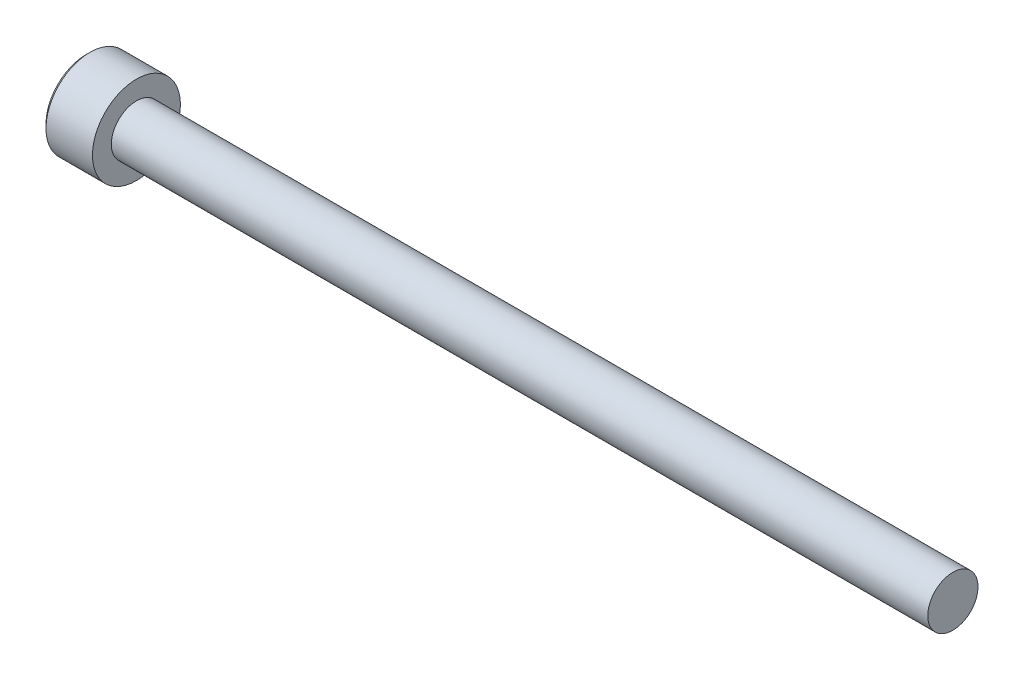
ISO-10303-21;
HEADER;
FILE_DESCRIPTION(('STEP AP214'),'2;1');
FILE_NAME('part.step','',(''),(''),'','','');
FILE_SCHEMA(('AUTOMOTIVE_DESIGN { 1 0 10303 214 1 1 1 1 }'));
ENDSEC;
DATA;
#1=APPLICATION_CONTEXT('core data for automotive mechanical design processes');
#2=APPLICATION_PROTOCOL_DEFINITION('international standard','automotive_design',2000,#1);
#3=PRODUCT_CONTEXT('',#1,'mechanical');
#4=PRODUCT('Part','Part','',(#3));
#5=PRODUCT_RELATED_PRODUCT_CATEGORY('part','',(#4));
#6=PRODUCT_DEFINITION_FORMATION('','',#4);
#7=PRODUCT_DEFINITION_CONTEXT('part definition',#1,'design');
#8=PRODUCT_DEFINITION('design','',#6,#7);
#9=PRODUCT_DEFINITION_SHAPE('','',#8);
#10=(LENGTH_UNIT() NAMED_UNIT(*) SI_UNIT(.MILLI.,.METRE.));
#11=(NAMED_UNIT(*) PLANE_ANGLE_UNIT() SI_UNIT($,.RADIAN.));
#12=(NAMED_UNIT(*) SI_UNIT($,.STERADIAN.) SOLID_ANGLE_UNIT());
#13=UNCERTAINTY_MEASURE_WITH_UNIT(LENGTH_MEASURE(1.E-05),#10,'distance_accuracy_value','');
#14=(GEOMETRIC_REPRESENTATION_CONTEXT(3) GLOBAL_UNCERTAINTY_ASSIGNED_CONTEXT((#13)) GLOBAL_UNIT_ASSIGNED_CONTEXT((#10,
#11,#12)) REPRESENTATION_CONTEXT('',''));
#15=CARTESIAN_POINT('',(0.,0.,0.));
#16=DIRECTION('',(0.,0.,1.));
#17=DIRECTION('',(1.,0.,0.));
#18=AXIS2_PLACEMENT_3D('',#15,#16,#17);
#19=CARTESIAN_POINT('',(-2.,0.,0.));
#20=DIRECTION('',(-1.,0.,0.));
#21=DIRECTION('',(0.,0.,1.));
#22=AXIS2_PLACEMENT_3D('',#19,#20,#21);
#23=PLANE('',#22);
#24=CARTESIAN_POINT('',(-2.,0.,0.));
#25=DIRECTION('',(-1.,0.,0.));
#26=DIRECTION('',(0.,-1.,0.));
#27=AXIS2_PLACEMENT_3D('',#24,#25,#26);
#28=CIRCLE('',#27,1.5);
#29=CARTESIAN_POINT('',(-2.,-1.29903810567666,0.75));
#30=VERTEX_POINT('',#29);
#31=CARTESIAN_POINT('',(-2.,0.,1.5));
#32=VERTEX_POINT('',#31);
#33=EDGE_CURVE('E47',#30,#32,#28,.T.);
#34=ORIENTED_EDGE('',*,*,#33,.F.);
#35=DIRECTION('',(0.,0.5,0.866025403784439));
#36=VECTOR('',#35,1.);
#37=CARTESIAN_POINT('',(-2.,-1.73205080756888,0.));
#38=LINE('',#37,#36);
#39=CARTESIAN_POINT('',(-2.,-0.866025403784439,1.5));
#40=VERTEX_POINT('',#39);
#41=EDGE_CURVE('E229',#30,#40,#38,.T.);
#42=ORIENTED_EDGE('',*,*,#41,.T.);
#43=DIRECTION('',(0.,1.,0.));
#44=VECTOR('',#43,1.);
#45=CARTESIAN_POINT('',(-2.,-0.866025403784439,1.5));
#46=LINE('',#45,#44);
#47=EDGE_CURVE('E197',#40,#32,#46,.T.);
#48=ORIENTED_EDGE('',*,*,#47,.T.);
#49=EDGE_LOOP('',(#34,#42,#48));
#50=FACE_BOUND('',#49,.T.);
#51=ADVANCED_FACE('F36',(#50),#23,.T.);
#52=CARTESIAN_POINT('',(-2.,1.29903810567666,0.75));
#53=VERTEX_POINT('',#52);
#54=EDGE_CURVE('E11',#32,#53,#28,.T.);
#55=ORIENTED_EDGE('',*,*,#54,.F.);
#56=CARTESIAN_POINT('',(-2.,0.866025403784439,1.5));
#57=VERTEX_POINT('',#56);
#58=EDGE_CURVE('E225',#32,#57,#46,.T.);
#59=ORIENTED_EDGE('',*,*,#58,.T.);
#60=DIRECTION('',(0.,0.5,-0.866025403784439));
#61=VECTOR('',#60,1.);
#62=CARTESIAN_POINT('',(-2.,0.866025403784439,1.5));
#63=LINE('',#62,#61);
#64=EDGE_CURVE('E242',#57,#53,#63,.T.);
#65=ORIENTED_EDGE('',*,*,#64,.T.);
#66=EDGE_LOOP('',(#55,#59,#65));
#67=FACE_BOUND('',#66,.T.);
#68=ADVANCED_FACE('F123',(#67),#23,.T.);
#69=CARTESIAN_POINT('',(-2.,1.29903810567666,-0.75));
#70=VERTEX_POINT('',#69);
#71=EDGE_CURVE('E45',#53,#70,#28,.T.);
#72=ORIENTED_EDGE('',*,*,#71,.F.);
#73=CARTESIAN_POINT('',(-2.,1.73205080756888,0.));
#74=VERTEX_POINT('',#73);
#75=EDGE_CURVE('E209',#53,#74,#63,.T.);
#76=ORIENTED_EDGE('',*,*,#75,.T.);
#77=DIRECTION('',(0.,-0.5,-0.866025403784439));
#78=VECTOR('',#77,1.);
#79=CARTESIAN_POINT('',(-2.,1.73205080756888,0.));
#80=LINE('',#79,#78);
#81=EDGE_CURVE('E238',#74,#70,#80,.T.);
#82=ORIENTED_EDGE('',*,*,#81,.T.);
#83=EDGE_LOOP('',(#72,#76,#82));
#84=FACE_BOUND('',#83,.T.);
#85=ADVANCED_FACE('F128',(#84),#23,.T.);
#86=CARTESIAN_POINT('',(-2.,0.,-1.5));
#87=VERTEX_POINT('',#86);
#88=EDGE_CURVE('E245',#70,#87,#28,.T.);
#89=ORIENTED_EDGE('',*,*,#88,.F.);
#90=CARTESIAN_POINT('',(-2.,0.866025403784439,-1.5));
#91=VERTEX_POINT('',#90);
#92=EDGE_CURVE('E241',#70,#91,#80,.T.);
#93=ORIENTED_EDGE('',*,*,#92,.T.);
#94=DIRECTION('',(0.,-1.,0.));
#95=VECTOR('',#94,1.);
#96=CARTESIAN_POINT('',(-2.,0.866025403784439,-1.5));
#97=LINE('',#96,#95);
#98=EDGE_CURVE('E234',#91,#87,#97,.T.);
#99=ORIENTED_EDGE('',*,*,#98,.T.);
#100=EDGE_LOOP('',(#89,#93,#99));
#101=FACE_BOUND('',#100,.T.);
#102=ADVANCED_FACE('F252',(#101),#23,.T.);
#103=CARTESIAN_POINT('',(-2.,-1.29903810567666,-0.75));
#104=VERTEX_POINT('',#103);
#105=EDGE_CURVE('E54',#87,#104,#28,.T.);
#106=ORIENTED_EDGE('',*,*,#105,.F.);
#107=CARTESIAN_POINT('',(-2.,-0.866025403784438,-1.5));
#108=VERTEX_POINT('',#107);
#109=EDGE_CURVE('E237',#87,#108,#97,.T.);
#110=ORIENTED_EDGE('',*,*,#109,.T.);
#111=DIRECTION('',(0.,-0.5,0.866025403784439));
#112=VECTOR('',#111,1.);
#113=CARTESIAN_POINT('',(-2.,-0.866025403784438,-1.5));
#114=LINE('',#113,#112);
#115=EDGE_CURVE('E230',#108,#104,#114,.T.);
#116=ORIENTED_EDGE('',*,*,#115,.T.);
#117=EDGE_LOOP('',(#106,#110,#116));
#118=FACE_BOUND('',#117,.T.);
#119=ADVANCED_FACE('F121',(#118),#23,.T.);
#120=CARTESIAN_POINT('',(-4.,0.,0.));
#121=DIRECTION('',(1.,0.,0.));
#122=DIRECTION('',(0.,1.,0.));
#123=AXIS2_PLACEMENT_3D('',#120,#121,#122);
#124=PLANE('',#123);
#125=DIRECTION('',(0.,-0.5,-0.866025403784439));
#126=VECTOR('',#125,1.);
#127=CARTESIAN_POINT('',(-4.,1.73205080756888,0.));
#128=LINE('',#127,#126);
#129=CARTESIAN_POINT('',(-4.,1.73205080756888,0.));
#130=VERTEX_POINT('',#129);
#131=CARTESIAN_POINT('',(-4.,0.866025403784439,-1.5));
#132=VERTEX_POINT('',#131);
#133=EDGE_CURVE('E219',#130,#132,#128,.T.);
#134=ORIENTED_EDGE('',*,*,#133,.F.);
#135=DIRECTION('',(0.,0.5,-0.866025403784439));
#136=VECTOR('',#135,1.);
#137=CARTESIAN_POINT('',(-4.,0.866025403784439,1.5));
#138=LINE('',#137,#136);
#139=CARTESIAN_POINT('',(-4.,0.866025403784439,1.5));
#140=VERTEX_POINT('',#139);
#141=EDGE_CURVE('E62',#140,#130,#138,.T.);
#142=ORIENTED_EDGE('',*,*,#141,.F.);
#143=DIRECTION('',(0.,1.,0.));
#144=VECTOR('',#143,1.);
#145=CARTESIAN_POINT('',(-4.,-0.866025403784439,1.5));
#146=LINE('',#145,#144);
#147=CARTESIAN_POINT('',(-4.,-0.866025403784439,1.5));
#148=VERTEX_POINT('',#147);
#149=EDGE_CURVE('E206',#148,#140,#146,.T.);
#150=ORIENTED_EDGE('',*,*,#149,.F.);
#151=DIRECTION('',(0.,0.5,0.866025403784439));
#152=VECTOR('',#151,1.);
#153=CARTESIAN_POINT('',(-4.,-1.73205080756888,0.));
#154=LINE('',#153,#152);
#155=CARTESIAN_POINT('',(-4.,-1.73205080756888,0.));
#156=VERTEX_POINT('',#155);
#157=EDGE_CURVE('E210',#156,#148,#154,.T.);
#158=ORIENTED_EDGE('',*,*,#157,.F.);
#159=DIRECTION('',(0.,-0.5,0.866025403784439));
#160=VECTOR('',#159,1.);
#161=CARTESIAN_POINT('',(-4.,-0.866025403784438,-1.5));
#162=LINE('',#161,#160);
#163=CARTESIAN_POINT('',(-4.,-0.866025403784438,-1.5));
#164=VERTEX_POINT('',#163);
#165=EDGE_CURVE('E213',#164,#156,#162,.T.);
#166=ORIENTED_EDGE('',*,*,#165,.F.);
#167=DIRECTION('',(0.,-1.,0.));
#168=VECTOR('',#167,1.);
#169=CARTESIAN_POINT('',(-4.,0.866025403784439,-1.5));
#170=LINE('',#169,#168);
#171=EDGE_CURVE('E216',#132,#164,#170,.T.);
#172=ORIENTED_EDGE('',*,*,#171,.F.);
#173=EDGE_LOOP('',(#134,#142,#150,#158,#166,#172));
#174=FACE_BOUND('',#173,.T.);
#175=CARTESIAN_POINT('',(-4.,0.,0.));
#176=DIRECTION('',(-1.,0.,0.));
#177=DIRECTION('',(0.,-1.,0.));
#178=AXIS2_PLACEMENT_3D('',#175,#176,#177);
#179=CIRCLE('',#178,3.2);
#180=CARTESIAN_POINT('',(-4.,-3.2,0.));
#181=VERTEX_POINT('',#180);
#182=EDGE_CURVE('E40',#181,#181,#179,.T.);
#183=ORIENTED_EDGE('',*,*,#182,.T.);
#184=EDGE_LOOP('',(#183));
#185=FACE_BOUND('',#184,.T.);
#186=ADVANCED_FACE('F38',(#174,#185),#124,.F.);
#187=CARTESIAN_POINT('',(-3.7,0.,0.));
#188=DIRECTION('',(1.,0.,0.));
#189=DIRECTION('',(0.,1.,0.));
#190=AXIS2_PLACEMENT_3D('',#187,#188,#189);
#191=CONICAL_SURFACE('',#190,3.5,0.785398163397448);
#192=ORIENTED_EDGE('',*,*,#182,.F.);
#193=EDGE_LOOP('',(#192));
#194=FACE_BOUND('',#193,.T.);
#195=CARTESIAN_POINT('',(-3.7,0.,0.));
#196=DIRECTION('',(-1.,0.,0.));
#197=DIRECTION('',(0.,-1.,0.));
#198=AXIS2_PLACEMENT_3D('',#195,#196,#197);
#199=CIRCLE('',#198,3.5);
#200=CARTESIAN_POINT('',(-3.7,-3.5,0.));
#201=VERTEX_POINT('',#200);
#202=EDGE_CURVE('E181',#201,#201,#199,.T.);
#203=ORIENTED_EDGE('',*,*,#202,.T.);
#204=EDGE_LOOP('',(#203));
#205=FACE_BOUND('',#204,.T.);
#206=ADVANCED_FACE('F168',(#194,#205),#191,.T.);
#207=CARTESIAN_POINT('',(-4.,0.,0.));
#208=DIRECTION('',(-1.,0.,0.));
#209=DIRECTION('',(0.,-1.,0.));
#210=AXIS2_PLACEMENT_3D('',#207,#208,#209);
#211=CYLINDRICAL_SURFACE('',#210,3.5);
#212=ORIENTED_EDGE('',*,*,#202,.F.);
#213=EDGE_LOOP('',(#212));
#214=FACE_BOUND('',#213,.T.);
#215=CARTESIAN_POINT('',(0.,0.,0.));
#216=DIRECTION('',(-1.,0.,0.));
#217=DIRECTION('',(0.,-1.,0.));
#218=AXIS2_PLACEMENT_3D('',#215,#216,#217);
#219=CIRCLE('',#218,3.5);
#220=CARTESIAN_POINT('',(0.,-3.5,0.));
#221=VERTEX_POINT('',#220);
#222=EDGE_CURVE('E182',#221,#221,#219,.T.);
#223=ORIENTED_EDGE('',*,*,#222,.T.);
#224=EDGE_LOOP('',(#223));
#225=FACE_BOUND('',#224,.T.);
#226=ADVANCED_FACE('F165',(#214,#225),#211,.T.);
#227=CARTESIAN_POINT('',(0.,3.5,0.));
#228=DIRECTION('',(-1.,0.,0.));
#229=DIRECTION('',(0.,-1.,0.));
#230=AXIS2_PLACEMENT_3D('',#227,#228,#229);
#231=PLANE('',#230);
#232=ORIENTED_EDGE('',*,*,#222,.F.);
#233=EDGE_LOOP('',(#232));
#234=FACE_BOUND('',#233,.T.);
#235=CARTESIAN_POINT('',(0.,0.,0.));
#236=DIRECTION('',(-1.,0.,0.));
#237=DIRECTION('',(0.,-1.,0.));
#238=AXIS2_PLACEMENT_3D('',#235,#236,#237);
#239=CIRCLE('',#238,2.);
#240=CARTESIAN_POINT('',(0.,-2.,0.));
#241=VERTEX_POINT('',#240);
#242=EDGE_CURVE('E185',#241,#241,#239,.T.);
#243=ORIENTED_EDGE('',*,*,#242,.T.);
#244=EDGE_LOOP('',(#243));
#245=FACE_BOUND('',#244,.T.);
#246=ADVANCED_FACE('F161',(#234,#245),#231,.F.);
#247=CARTESIAN_POINT('',(-4.,0.,0.));
#248=DIRECTION('',(-1.,0.,0.));
#249=DIRECTION('',(0.,-1.,0.));
#250=AXIS2_PLACEMENT_3D('',#247,#248,#249);
#251=CYLINDRICAL_SURFACE('',#250,2.);
#252=ORIENTED_EDGE('',*,*,#242,.F.);
#253=EDGE_LOOP('',(#252));
#254=FACE_BOUND('',#253,.T.);
#255=CARTESIAN_POINT('',(65.,0.,0.));
#256=DIRECTION('',(-1.,0.,0.));
#257=DIRECTION('',(0.,-1.,0.));
#258=AXIS2_PLACEMENT_3D('',#255,#256,#257);
#259=CIRCLE('',#258,2.);
#260=CARTESIAN_POINT('',(65.,-2.,0.));
#261=VERTEX_POINT('',#260);
#262=EDGE_CURVE('E190',#261,#261,#259,.T.);
#263=ORIENTED_EDGE('',*,*,#262,.T.);
#264=EDGE_LOOP('',(#263));
#265=FACE_BOUND('',#264,.T.);
#266=ADVANCED_FACE('F157',(#254,#265),#251,.T.);
#267=CARTESIAN_POINT('',(65.,2.,0.));
#268=DIRECTION('',(-1.,0.,0.));
#269=DIRECTION('',(0.,-1.,0.));
#270=AXIS2_PLACEMENT_3D('',#267,#268,#269);
#271=PLANE('',#270);
#272=ORIENTED_EDGE('',*,*,#262,.F.);
#273=EDGE_LOOP('',(#272));
#274=FACE_BOUND('',#273,.T.);
#275=ADVANCED_FACE('F154',(#274),#271,.F.);
#276=CARTESIAN_POINT('',(-2.,0.866025403784439,1.5));
#277=DIRECTION('',(0.,0.866025403784439,0.5));
#278=DIRECTION('',(0.,-0.5,0.866025403784439));
#279=AXIS2_PLACEMENT_3D('',#276,#277,#278);
#280=PLANE('',#279);
#281=ORIENTED_EDGE('',*,*,#141,.T.);
#282=DIRECTION('',(-1.,0.,0.));
#283=VECTOR('',#282,1.);
#284=CARTESIAN_POINT('',(-2.,1.73205080756888,0.));
#285=LINE('',#284,#283);
#286=EDGE_CURVE('E194',#74,#130,#285,.T.);
#287=ORIENTED_EDGE('',*,*,#286,.F.);
#288=ORIENTED_EDGE('',*,*,#75,.F.);
#289=ORIENTED_EDGE('',*,*,#64,.F.);
#290=DIRECTION('',(-1.,0.,0.));
#291=VECTOR('',#290,1.);
#292=CARTESIAN_POINT('',(-2.,0.866025403784439,1.5));
#293=LINE('',#292,#291);
#294=EDGE_CURVE('E193',#57,#140,#293,.T.);
#295=ORIENTED_EDGE('',*,*,#294,.T.);
#296=EDGE_LOOP('',(#281,#287,#288,#289,#295));
#297=FACE_BOUND('',#296,.T.);
#298=ADVANCED_FACE('F136',(#297),#280,.F.);
#299=CARTESIAN_POINT('',(-2.,-0.866025403784439,1.5));
#300=DIRECTION('',(0.,0.,1.));
#301=DIRECTION('',(0.,-1.,0.));
#302=AXIS2_PLACEMENT_3D('',#299,#300,#301);
#303=PLANE('',#302);
#304=ORIENTED_EDGE('',*,*,#149,.T.);
#305=ORIENTED_EDGE('',*,*,#294,.F.);
#306=ORIENTED_EDGE('',*,*,#58,.F.);
#307=ORIENTED_EDGE('',*,*,#47,.F.);
#308=DIRECTION('',(-1.,0.,0.));
#309=VECTOR('',#308,1.);
#310=CARTESIAN_POINT('',(-2.,-0.866025403784439,1.5));
#311=LINE('',#310,#309);
#312=EDGE_CURVE('E203',#40,#148,#311,.T.);
#313=ORIENTED_EDGE('',*,*,#312,.T.);
#314=EDGE_LOOP('',(#304,#305,#306,#307,#313));
#315=FACE_BOUND('',#314,.T.);
#316=ADVANCED_FACE('F132',(#315),#303,.F.);
#317=CARTESIAN_POINT('',(-2.,-1.73205080756888,0.));
#318=DIRECTION('',(0.,-0.866025403784439,0.5));
#319=DIRECTION('',(0.,-0.5,-0.866025403784439));
#320=AXIS2_PLACEMENT_3D('',#317,#318,#319);
#321=PLANE('',#320);
#322=ORIENTED_EDGE('',*,*,#157,.T.);
#323=ORIENTED_EDGE('',*,*,#312,.F.);
#324=ORIENTED_EDGE('',*,*,#41,.F.);
#325=CARTESIAN_POINT('',(-2.,-1.73205080756888,0.));
#326=VERTEX_POINT('',#325);
#327=EDGE_CURVE('E226',#326,#30,#38,.T.);
#328=ORIENTED_EDGE('',*,*,#327,.F.);
#329=DIRECTION('',(-1.,0.,0.));
#330=VECTOR('',#329,1.);
#331=CARTESIAN_POINT('',(-2.,-1.73205080756888,0.));
#332=LINE('',#331,#330);
#333=EDGE_CURVE('E201',#326,#156,#332,.T.);
#334=ORIENTED_EDGE('',*,*,#333,.T.);
#335=EDGE_LOOP('',(#322,#323,#324,#328,#334));
#336=FACE_BOUND('',#335,.T.);
#337=ADVANCED_FACE('F135',(#336),#321,.F.);
#338=CARTESIAN_POINT('',(-2.,-0.866025403784438,-1.5));
#339=DIRECTION('',(0.,-0.866025403784439,-0.5));
#340=DIRECTION('',(0.,0.5,-0.866025403784439));
#341=AXIS2_PLACEMENT_3D('',#338,#339,#340);
#342=PLANE('',#341);
#343=ORIENTED_EDGE('',*,*,#165,.T.);
#344=ORIENTED_EDGE('',*,*,#333,.F.);
#345=EDGE_CURVE('E233',#104,#326,#114,.T.);
#346=ORIENTED_EDGE('',*,*,#345,.F.);
#347=ORIENTED_EDGE('',*,*,#115,.F.);
#348=DIRECTION('',(-1.,0.,0.));
#349=VECTOR('',#348,1.);
#350=CARTESIAN_POINT('',(-2.,-0.866025403784438,-1.5));
#351=LINE('',#350,#349);
#352=EDGE_CURVE('E199',#108,#164,#351,.T.);
#353=ORIENTED_EDGE('',*,*,#352,.T.);
#354=EDGE_LOOP('',(#343,#344,#346,#347,#353));
#355=FACE_BOUND('',#354,.T.);
#356=ADVANCED_FACE('F140',(#355),#342,.F.);
#357=CARTESIAN_POINT('',(-2.,0.866025403784439,-1.5));
#358=DIRECTION('',(0.,0.,-1.));
#359=DIRECTION('',(0.,1.,0.));
#360=AXIS2_PLACEMENT_3D('',#357,#358,#359);
#361=PLANE('',#360);
#362=ORIENTED_EDGE('',*,*,#171,.T.);
#363=ORIENTED_EDGE('',*,*,#352,.F.);
#364=ORIENTED_EDGE('',*,*,#109,.F.);
#365=ORIENTED_EDGE('',*,*,#98,.F.);
#366=DIRECTION('',(-1.,0.,0.));
#367=VECTOR('',#366,1.);
#368=CARTESIAN_POINT('',(-2.,0.866025403784439,-1.5));
#369=LINE('',#368,#367);
#370=EDGE_CURVE('E196',#91,#132,#369,.T.);
#371=ORIENTED_EDGE('',*,*,#370,.T.);
#372=EDGE_LOOP('',(#362,#363,#364,#365,#371));
#373=FACE_BOUND('',#372,.T.);
#374=ADVANCED_FACE('F144',(#373),#361,.F.);
#375=CARTESIAN_POINT('',(-2.,1.73205080756888,0.));
#376=DIRECTION('',(0.,0.866025403784439,-0.5));
#377=DIRECTION('',(0.,0.5,0.866025403784439));
#378=AXIS2_PLACEMENT_3D('',#375,#376,#377);
#379=PLANE('',#378);
#380=ORIENTED_EDGE('',*,*,#133,.T.);
#381=ORIENTED_EDGE('',*,*,#370,.F.);
#382=ORIENTED_EDGE('',*,*,#92,.F.);
#383=ORIENTED_EDGE('',*,*,#81,.F.);
#384=ORIENTED_EDGE('',*,*,#286,.T.);
#385=EDGE_LOOP('',(#380,#381,#382,#383,#384));
#386=FACE_BOUND('',#385,.T.);
#387=ADVANCED_FACE('F118',(#386),#379,.F.);
#388=EDGE_CURVE('E183',#104,#30,#28,.T.);
#389=ORIENTED_EDGE('',*,*,#388,.F.);
#390=ORIENTED_EDGE('',*,*,#345,.T.);
#391=ORIENTED_EDGE('',*,*,#327,.T.);
#392=EDGE_LOOP('',(#389,#390,#391));
#393=FACE_BOUND('',#392,.T.);
#394=ADVANCED_FACE('F113',(#393),#23,.T.);
#395=CARTESIAN_POINT('',(-1.09870907145865,0.,0.));
#396=DIRECTION('',(-1.,0.,0.));
#397=DIRECTION('',(0.,-1.,0.));
#398=AXIS2_PLACEMENT_3D('',#395,#396,#397);
#399=CONICAL_SURFACE('',#398,0.,1.02974425867665);
#400=ORIENTED_EDGE('',*,*,#33,.T.);
#401=ORIENTED_EDGE('',*,*,#54,.T.);
#402=ORIENTED_EDGE('',*,*,#71,.T.);
#403=ORIENTED_EDGE('',*,*,#88,.T.);
#404=ORIENTED_EDGE('',*,*,#105,.T.);
#405=ORIENTED_EDGE('',*,*,#388,.T.);
#406=EDGE_LOOP('',(#400,#401,#402,#403,#404,#405));
#407=FACE_BOUND('',#406,.T.);
#408=CARTESIAN_POINT('',(-1.09870907145865,0.,0.));
#409=VERTEX_POINT('',#408);
#410=VERTEX_LOOP('',#409);
#411=FACE_BOUND('',#410,.T.);
#412=ADVANCED_FACE('F111',(#407,#411),#399,.F.);
#413=CLOSED_SHELL('',(#51,#68,#85,#102,#119,#186,#206,#226,#246,#266,#275,#298,#316,#337,#356,
#374,#387,#394,#412));
#414=MANIFOLD_SOLID_BREP('B2',#413);
#415=ADVANCED_BREP_SHAPE_REPRESENTATION('',(#18,#414),#14);
#416=SHAPE_DEFINITION_REPRESENTATION(#9,#415);
ENDSEC;
END-ISO-10303-21;
